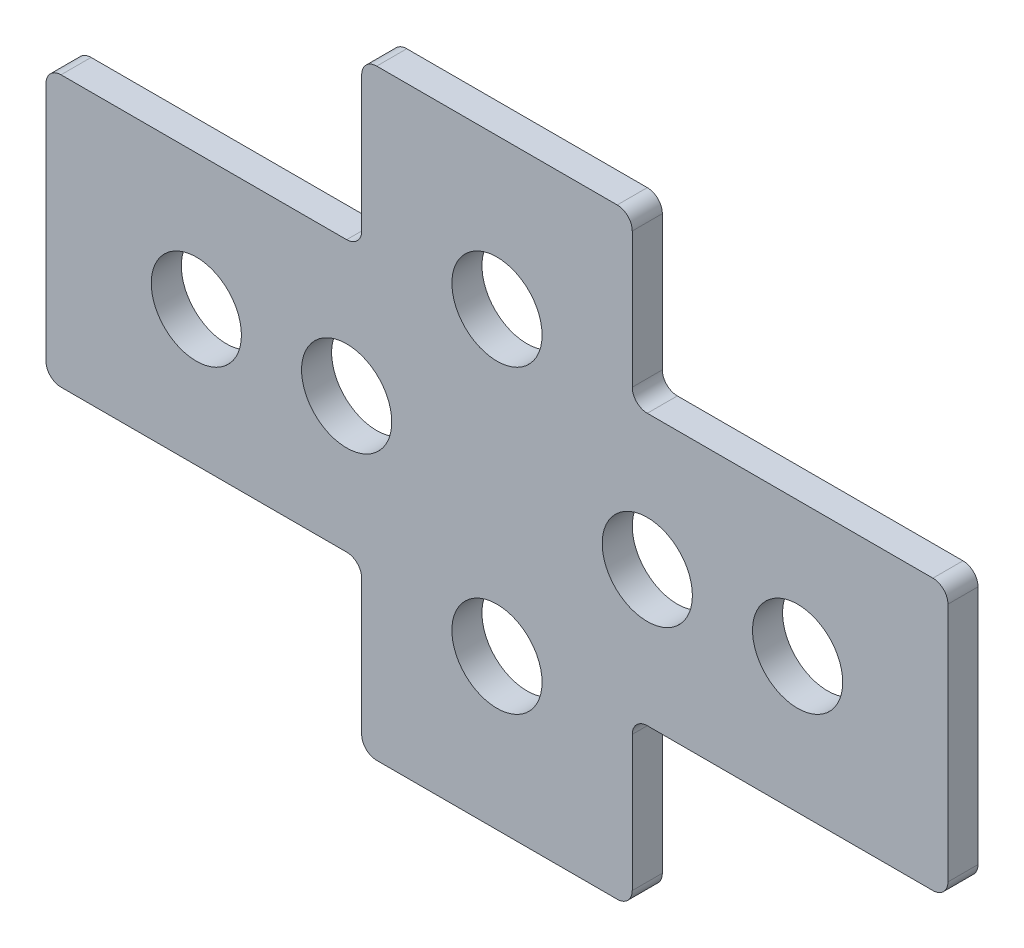
ISO-10303-21;
HEADER;
FILE_DESCRIPTION(('STEP AP214'),'2;1');
FILE_NAME('part.step','',(''),(''),'','','');
FILE_SCHEMA(('AUTOMOTIVE_DESIGN { 1 0 10303 214 1 1 1 1 }'));
ENDSEC;
DATA;
#1=APPLICATION_CONTEXT('core data for automotive mechanical design processes');
#2=APPLICATION_PROTOCOL_DEFINITION('international standard','automotive_design',2000,#1);
#3=PRODUCT_CONTEXT('',#1,'mechanical');
#4=PRODUCT('Part','Part','',(#3));
#5=PRODUCT_RELATED_PRODUCT_CATEGORY('part','',(#4));
#6=PRODUCT_DEFINITION_FORMATION('','',#4);
#7=PRODUCT_DEFINITION_CONTEXT('part definition',#1,'design');
#8=PRODUCT_DEFINITION('design','',#6,#7);
#9=PRODUCT_DEFINITION_SHAPE('','',#8);
#10=(LENGTH_UNIT() NAMED_UNIT(*) SI_UNIT(.MILLI.,.METRE.));
#11=(NAMED_UNIT(*) PLANE_ANGLE_UNIT() SI_UNIT($,.RADIAN.));
#12=(NAMED_UNIT(*) SI_UNIT($,.STERADIAN.) SOLID_ANGLE_UNIT());
#13=UNCERTAINTY_MEASURE_WITH_UNIT(LENGTH_MEASURE(1.E-05),#10,'distance_accuracy_value','');
#14=(GEOMETRIC_REPRESENTATION_CONTEXT(3) GLOBAL_UNCERTAINTY_ASSIGNED_CONTEXT((#13)) GLOBAL_UNIT_ASSIGNED_CONTEXT((#10,
#11,#12)) REPRESENTATION_CONTEXT('',''));
#15=CARTESIAN_POINT('',(0.,0.,0.));
#16=DIRECTION('',(0.,0.,1.));
#17=DIRECTION('',(1.,0.,0.));
#18=AXIS2_PLACEMENT_3D('',#15,#16,#17);
#19=CARTESIAN_POINT('',(-8.00000000000045,-9.00000000000045,2.));
#20=DIRECTION('',(0.,0.,1.));
#21=DIRECTION('',(1.,0.,0.));
#22=AXIS2_PLACEMENT_3D('',#19,#20,#21);
#23=PLANE('',#22);
#24=CARTESIAN_POINT('',(20.,10.,2.));
#25=DIRECTION('',(0.,0.,1.));
#26=DIRECTION('',(1.,0.,0.));
#27=AXIS2_PLACEMENT_3D('',#24,#25,#26);
#28=CIRCLE('',#27,3.);
#29=CARTESIAN_POINT('',(23.,10.,2.));
#30=VERTEX_POINT('',#29);
#31=EDGE_CURVE('E460',#30,#30,#28,.T.);
#32=ORIENTED_EDGE('',*,*,#31,.F.);
#33=EDGE_LOOP('',(#32));
#34=FACE_BOUND('',#33,.T.);
#35=CARTESIAN_POINT('',(-20.,10.,2.));
#36=DIRECTION('',(0.,0.,1.));
#37=DIRECTION('',(1.,0.,0.));
#38=AXIS2_PLACEMENT_3D('',#35,#36,#37);
#39=CIRCLE('',#38,3.);
#40=CARTESIAN_POINT('',(-17.,10.,2.));
#41=VERTEX_POINT('',#40);
#42=EDGE_CURVE('E472',#41,#41,#39,.T.);
#43=ORIENTED_EDGE('',*,*,#42,.F.);
#44=EDGE_LOOP('',(#43));
#45=FACE_BOUND('',#44,.T.);
#46=CARTESIAN_POINT('',(0.,20.,2.));
#47=DIRECTION('',(0.,0.,1.));
#48=DIRECTION('',(1.,0.,0.));
#49=AXIS2_PLACEMENT_3D('',#46,#47,#48);
#50=CIRCLE('',#49,3.);
#51=CARTESIAN_POINT('',(3.,20.,2.));
#52=VERTEX_POINT('',#51);
#53=EDGE_CURVE('E234',#52,#52,#50,.T.);
#54=ORIENTED_EDGE('',*,*,#53,.F.);
#55=EDGE_LOOP('',(#54));
#56=FACE_BOUND('',#55,.T.);
#57=CARTESIAN_POINT('',(-8.00000000000045,-9.00000000000045,2.));
#58=DIRECTION('',(0.,0.,1.));
#59=DIRECTION('',(1.,0.,0.));
#60=AXIS2_PLACEMENT_3D('',#57,#58,#59);
#61=CIRCLE('',#60,0.999999999999545);
#62=CARTESIAN_POINT('',(-9.,-9.,2.));
#63=VERTEX_POINT('',#62);
#64=CARTESIAN_POINT('',(-8.,-10.,2.));
#65=VERTEX_POINT('',#64);
#66=EDGE_CURVE('E277',#63,#65,#61,.T.);
#67=ORIENTED_EDGE('',*,*,#66,.T.);
#68=DIRECTION('',(1.,0.,0.));
#69=VECTOR('',#68,1.);
#70=CARTESIAN_POINT('',(-8.,-10.,2.));
#71=LINE('',#70,#69);
#72=CARTESIAN_POINT('',(8.,-10.0000000000002,2.));
#73=VERTEX_POINT('',#72);
#74=EDGE_CURVE('E145',#65,#73,#71,.T.);
#75=ORIENTED_EDGE('',*,*,#74,.T.);
#76=CARTESIAN_POINT('',(7.99999999999955,-9.,2.));
#77=DIRECTION('',(0.,0.,1.));
#78=DIRECTION('',(1.,0.,0.));
#79=AXIS2_PLACEMENT_3D('',#76,#77,#78);
#80=CIRCLE('',#79,1.00000000000023);
#81=CARTESIAN_POINT('',(9.,-9.,2.));
#82=VERTEX_POINT('',#81);
#83=EDGE_CURVE('E340',#73,#82,#80,.T.);
#84=ORIENTED_EDGE('',*,*,#83,.T.);
#85=DIRECTION('',(0.,1.,0.));
#86=VECTOR('',#85,1.);
#87=CARTESIAN_POINT('',(9.,-9.,2.));
#88=LINE('',#87,#86);
#89=CARTESIAN_POINT('',(9.,0.,2.));
#90=VERTEX_POINT('',#89);
#91=EDGE_CURVE('E359',#82,#90,#88,.T.);
#92=ORIENTED_EDGE('',*,*,#91,.T.);
#93=CARTESIAN_POINT('',(10.,0.,2.));
#94=DIRECTION('',(0.,0.,-1.));
#95=DIRECTION('',(1.,0.,0.));
#96=AXIS2_PLACEMENT_3D('',#93,#94,#95);
#97=CIRCLE('',#96,1.);
#98=CARTESIAN_POINT('',(10.,1.,2.));
#99=VERTEX_POINT('',#98);
#100=EDGE_CURVE('E356',#90,#99,#97,.T.);
#101=ORIENTED_EDGE('',*,*,#100,.T.);
#102=DIRECTION('',(1.,0.,0.));
#103=VECTOR('',#102,1.);
#104=CARTESIAN_POINT('',(10.,1.,2.));
#105=LINE('',#104,#103);
#106=CARTESIAN_POINT('',(29.,1.,2.));
#107=VERTEX_POINT('',#106);
#108=EDGE_CURVE('E358',#99,#107,#105,.T.);
#109=ORIENTED_EDGE('',*,*,#108,.T.);
#110=CARTESIAN_POINT('',(29.,2.,2.));
#111=DIRECTION('',(0.,0.,1.));
#112=DIRECTION('',(1.,0.,0.));
#113=AXIS2_PLACEMENT_3D('',#110,#111,#112);
#114=CIRCLE('',#113,0.999999999999999);
#115=CARTESIAN_POINT('',(30.,2.,2.));
#116=VERTEX_POINT('',#115);
#117=EDGE_CURVE('E361',#107,#116,#114,.T.);
#118=ORIENTED_EDGE('',*,*,#117,.T.);
#119=DIRECTION('',(0.,1.,0.));
#120=VECTOR('',#119,1.);
#121=CARTESIAN_POINT('',(30.,18.,2.));
#122=LINE('',#121,#120);
#123=CARTESIAN_POINT('',(30.,18.,2.));
#124=VERTEX_POINT('',#123);
#125=EDGE_CURVE('E367',#116,#124,#122,.T.);
#126=ORIENTED_EDGE('',*,*,#125,.T.);
#127=CARTESIAN_POINT('',(29.0000000000005,18.0000000000005,2.));
#128=DIRECTION('',(0.,0.,1.));
#129=DIRECTION('',(1.,0.,0.));
#130=AXIS2_PLACEMENT_3D('',#127,#128,#129);
#131=CIRCLE('',#130,0.999999999999543);
#132=CARTESIAN_POINT('',(29.,19.,2.));
#133=VERTEX_POINT('',#132);
#134=EDGE_CURVE('E369',#124,#133,#131,.T.);
#135=ORIENTED_EDGE('',*,*,#134,.T.);
#136=DIRECTION('',(-1.,0.,0.));
#137=VECTOR('',#136,1.);
#138=CARTESIAN_POINT('',(10.,19.,2.));
#139=LINE('',#138,#137);
#140=CARTESIAN_POINT('',(10.,19.,2.));
#141=VERTEX_POINT('',#140);
#142=EDGE_CURVE('E371',#133,#141,#139,.T.);
#143=ORIENTED_EDGE('',*,*,#142,.T.);
#144=CARTESIAN_POINT('',(10.,20.,2.));
#145=DIRECTION('',(0.,0.,-1.));
#146=DIRECTION('',(1.,0.,0.));
#147=AXIS2_PLACEMENT_3D('',#144,#145,#146);
#148=CIRCLE('',#147,1.);
#149=CARTESIAN_POINT('',(9.,20.,2.));
#150=VERTEX_POINT('',#149);
#151=EDGE_CURVE('E373',#141,#150,#148,.T.);
#152=ORIENTED_EDGE('',*,*,#151,.T.);
#153=DIRECTION('',(0.,1.,0.));
#154=VECTOR('',#153,1.);
#155=CARTESIAN_POINT('',(9.,20.,2.));
#156=LINE('',#155,#154);
#157=CARTESIAN_POINT('',(9.,29.,2.));
#158=VERTEX_POINT('',#157);
#159=EDGE_CURVE('E375',#150,#158,#156,.T.);
#160=ORIENTED_EDGE('',*,*,#159,.T.);
#161=CARTESIAN_POINT('',(8.00000000000045,29.0000000000005,2.));
#162=DIRECTION('',(0.,0.,1.));
#163=DIRECTION('',(1.,0.,0.));
#164=AXIS2_PLACEMENT_3D('',#161,#162,#163);
#165=CIRCLE('',#164,0.999999999999545);
#166=CARTESIAN_POINT('',(8.,30.,2.));
#167=VERTEX_POINT('',#166);
#168=EDGE_CURVE('E377',#158,#167,#165,.T.);
#169=ORIENTED_EDGE('',*,*,#168,.T.);
#170=DIRECTION('',(-1.,0.,0.));
#171=VECTOR('',#170,1.);
#172=CARTESIAN_POINT('',(8.,30.,2.));
#173=LINE('',#172,#171);
#174=CARTESIAN_POINT('',(-8.,30.,2.));
#175=VERTEX_POINT('',#174);
#176=EDGE_CURVE('E379',#167,#175,#173,.T.);
#177=ORIENTED_EDGE('',*,*,#176,.T.);
#178=CARTESIAN_POINT('',(-8.,29.,2.));
#179=DIRECTION('',(0.,0.,1.));
#180=DIRECTION('',(1.,0.,0.));
#181=AXIS2_PLACEMENT_3D('',#178,#179,#180);
#182=CIRCLE('',#181,0.999999999999999);
#183=CARTESIAN_POINT('',(-9.,29.,2.));
#184=VERTEX_POINT('',#183);
#185=EDGE_CURVE('E381',#175,#184,#182,.T.);
#186=ORIENTED_EDGE('',*,*,#185,.T.);
#187=DIRECTION('',(0.,-1.,0.));
#188=VECTOR('',#187,1.);
#189=CARTESIAN_POINT('',(-9.,20.,2.));
#190=LINE('',#189,#188);
#191=CARTESIAN_POINT('',(-9.,20.,2.));
#192=VERTEX_POINT('',#191);
#193=EDGE_CURVE('E383',#184,#192,#190,.T.);
#194=ORIENTED_EDGE('',*,*,#193,.T.);
#195=CARTESIAN_POINT('',(-10.,20.,2.));
#196=DIRECTION('',(0.,0.,-1.));
#197=DIRECTION('',(1.,0.,0.));
#198=AXIS2_PLACEMENT_3D('',#195,#196,#197);
#199=CIRCLE('',#198,1.);
#200=CARTESIAN_POINT('',(-10.,19.,2.));
#201=VERTEX_POINT('',#200);
#202=EDGE_CURVE('E385',#192,#201,#199,.T.);
#203=ORIENTED_EDGE('',*,*,#202,.T.);
#204=DIRECTION('',(-1.,0.,0.));
#205=VECTOR('',#204,1.);
#206=CARTESIAN_POINT('',(-29.,19.,2.));
#207=LINE('',#206,#205);
#208=CARTESIAN_POINT('',(-29.,19.,2.));
#209=VERTEX_POINT('',#208);
#210=EDGE_CURVE('E387',#201,#209,#207,.T.);
#211=ORIENTED_EDGE('',*,*,#210,.T.);
#212=CARTESIAN_POINT('',(-29.,18.,2.));
#213=DIRECTION('',(0.,0.,1.));
#214=DIRECTION('',(1.,0.,0.));
#215=AXIS2_PLACEMENT_3D('',#212,#213,#214);
#216=CIRCLE('',#215,0.999999999999997);
#217=CARTESIAN_POINT('',(-30.,18.,2.));
#218=VERTEX_POINT('',#217);
#219=EDGE_CURVE('E389',#209,#218,#216,.T.);
#220=ORIENTED_EDGE('',*,*,#219,.T.);
#221=DIRECTION('',(0.,-1.,0.));
#222=VECTOR('',#221,1.);
#223=CARTESIAN_POINT('',(-30.,2.,2.));
#224=LINE('',#223,#222);
#225=CARTESIAN_POINT('',(-30.,2.,2.));
#226=VERTEX_POINT('',#225);
#227=EDGE_CURVE('E391',#218,#226,#224,.T.);
#228=ORIENTED_EDGE('',*,*,#227,.T.);
#229=CARTESIAN_POINT('',(-29.0000000000005,1.99999999999955,2.));
#230=DIRECTION('',(0.,0.,1.));
#231=DIRECTION('',(1.,0.,0.));
#232=AXIS2_PLACEMENT_3D('',#229,#230,#231);
#233=CIRCLE('',#232,0.999999999999544);
#234=CARTESIAN_POINT('',(-29.,1.,2.));
#235=VERTEX_POINT('',#234);
#236=EDGE_CURVE('E212',#226,#235,#233,.T.);
#237=ORIENTED_EDGE('',*,*,#236,.T.);
#238=DIRECTION('',(1.,0.,0.));
#239=VECTOR('',#238,1.);
#240=CARTESIAN_POINT('',(-29.,1.,2.));
#241=LINE('',#240,#239);
#242=CARTESIAN_POINT('',(-9.99999999999955,1.,2.));
#243=VERTEX_POINT('',#242);
#244=EDGE_CURVE('E206',#235,#243,#241,.T.);
#245=ORIENTED_EDGE('',*,*,#244,.T.);
#246=CARTESIAN_POINT('',(-9.99999999999955,0.,2.));
#247=DIRECTION('',(0.,0.,-1.));
#248=DIRECTION('',(1.,0.,0.));
#249=AXIS2_PLACEMENT_3D('',#246,#247,#248);
#250=CIRCLE('',#249,1.);
#251=CARTESIAN_POINT('',(-8.99999999999955,0.,2.));
#252=VERTEX_POINT('',#251);
#253=EDGE_CURVE('E210',#243,#252,#250,.T.);
#254=ORIENTED_EDGE('',*,*,#253,.T.);
#255=DIRECTION('',(0.,-1.,0.));
#256=VECTOR('',#255,1.);
#257=CARTESIAN_POINT('',(-9.,-9.,2.));
#258=LINE('',#257,#256);
#259=EDGE_CURVE('E54',#252,#63,#258,.T.);
#260=ORIENTED_EDGE('',*,*,#259,.T.);
#261=EDGE_LOOP('',(#67,#75,#84,#92,#101,#109,#118,#126,#135,#143,#152,#160,#169,#177,#186,#194,
#203,#211,#220,#228,#237,#245,#254,#260));
#262=FACE_BOUND('',#261,.T.);
#263=CARTESIAN_POINT('',(0.,0.,2.));
#264=DIRECTION('',(0.,0.,1.));
#265=DIRECTION('',(1.,0.,0.));
#266=AXIS2_PLACEMENT_3D('',#263,#264,#265);
#267=CIRCLE('',#266,3.);
#268=CARTESIAN_POINT('',(3.,0.,2.));
#269=VERTEX_POINT('',#268);
#270=EDGE_CURVE('E478',#269,#269,#267,.T.);
#271=ORIENTED_EDGE('',*,*,#270,.F.);
#272=EDGE_LOOP('',(#271));
#273=FACE_BOUND('',#272,.T.);
#274=CARTESIAN_POINT('',(-10.,10.,2.));
#275=DIRECTION('',(0.,0.,1.));
#276=DIRECTION('',(1.,0.,0.));
#277=AXIS2_PLACEMENT_3D('',#274,#275,#276);
#278=CIRCLE('',#277,3.);
#279=CARTESIAN_POINT('',(-7.,10.,2.));
#280=VERTEX_POINT('',#279);
#281=EDGE_CURVE('E466',#280,#280,#278,.T.);
#282=ORIENTED_EDGE('',*,*,#281,.F.);
#283=EDGE_LOOP('',(#282));
#284=FACE_BOUND('',#283,.T.);
#285=CARTESIAN_POINT('',(10.,10.,2.));
#286=DIRECTION('',(0.,0.,1.));
#287=DIRECTION('',(1.,0.,0.));
#288=AXIS2_PLACEMENT_3D('',#285,#286,#287);
#289=CIRCLE('',#288,3.);
#290=CARTESIAN_POINT('',(13.,10.,2.));
#291=VERTEX_POINT('',#290);
#292=EDGE_CURVE('E451',#291,#291,#289,.T.);
#293=ORIENTED_EDGE('',*,*,#292,.F.);
#294=EDGE_LOOP('',(#293));
#295=FACE_BOUND('',#294,.T.);
#296=ADVANCED_FACE('F37',(#34,#45,#56,#262,#273,#284,#295),#23,.T.);
#297=CARTESIAN_POINT('',(-8.00000000000045,-9.00000000000045,0.));
#298=DIRECTION('',(0.,0.,1.));
#299=DIRECTION('',(1.,0.,0.));
#300=AXIS2_PLACEMENT_3D('',#297,#298,#299);
#301=PLANE('',#300);
#302=CARTESIAN_POINT('',(20.,10.,0.));
#303=DIRECTION('',(0.,0.,1.));
#304=DIRECTION('',(1.,0.,0.));
#305=AXIS2_PLACEMENT_3D('',#302,#303,#304);
#306=CIRCLE('',#305,3.);
#307=CARTESIAN_POINT('',(23.,10.,0.));
#308=VERTEX_POINT('',#307);
#309=EDGE_CURVE('E457',#308,#308,#306,.T.);
#310=ORIENTED_EDGE('',*,*,#309,.T.);
#311=EDGE_LOOP('',(#310));
#312=FACE_BOUND('',#311,.T.);
#313=CARTESIAN_POINT('',(-20.,10.,0.));
#314=DIRECTION('',(0.,0.,1.));
#315=DIRECTION('',(1.,0.,0.));
#316=AXIS2_PLACEMENT_3D('',#313,#314,#315);
#317=CIRCLE('',#316,3.);
#318=CARTESIAN_POINT('',(-17.,10.,0.));
#319=VERTEX_POINT('',#318);
#320=EDGE_CURVE('E469',#319,#319,#317,.T.);
#321=ORIENTED_EDGE('',*,*,#320,.T.);
#322=EDGE_LOOP('',(#321));
#323=FACE_BOUND('',#322,.T.);
#324=CARTESIAN_POINT('',(0.,20.,0.));
#325=DIRECTION('',(0.,0.,1.));
#326=DIRECTION('',(1.,0.,0.));
#327=AXIS2_PLACEMENT_3D('',#324,#325,#326);
#328=CIRCLE('',#327,3.);
#329=CARTESIAN_POINT('',(3.,20.,0.));
#330=VERTEX_POINT('',#329);
#331=EDGE_CURVE('E481',#330,#330,#328,.T.);
#332=ORIENTED_EDGE('',*,*,#331,.T.);
#333=EDGE_LOOP('',(#332));
#334=FACE_BOUND('',#333,.T.);
#335=CARTESIAN_POINT('',(-8.00000000000045,-9.00000000000045,0.));
#336=DIRECTION('',(0.,0.,1.));
#337=DIRECTION('',(1.,0.,0.));
#338=AXIS2_PLACEMENT_3D('',#335,#336,#337);
#339=CIRCLE('',#338,0.999999999999545);
#340=CARTESIAN_POINT('',(-9.,-9.,0.));
#341=VERTEX_POINT('',#340);
#342=CARTESIAN_POINT('',(-8.,-10.,0.));
#343=VERTEX_POINT('',#342);
#344=EDGE_CURVE('E230',#341,#343,#339,.T.);
#345=ORIENTED_EDGE('',*,*,#344,.F.);
#346=DIRECTION('',(0.,-1.,0.));
#347=VECTOR('',#346,1.);
#348=CARTESIAN_POINT('',(-9.,-9.,0.));
#349=LINE('',#348,#347);
#350=CARTESIAN_POINT('',(-8.99999999999955,0.,0.));
#351=VERTEX_POINT('',#350);
#352=EDGE_CURVE('E137',#351,#341,#349,.T.);
#353=ORIENTED_EDGE('',*,*,#352,.F.);
#354=CARTESIAN_POINT('',(-9.99999999999955,0.,0.));
#355=DIRECTION('',(0.,0.,-1.));
#356=DIRECTION('',(1.,0.,0.));
#357=AXIS2_PLACEMENT_3D('',#354,#355,#356);
#358=CIRCLE('',#357,1.);
#359=CARTESIAN_POINT('',(-9.99999999999955,1.,0.));
#360=VERTEX_POINT('',#359);
#361=EDGE_CURVE('E131',#360,#351,#358,.T.);
#362=ORIENTED_EDGE('',*,*,#361,.F.);
#363=DIRECTION('',(1.,0.,0.));
#364=VECTOR('',#363,1.);
#365=CARTESIAN_POINT('',(-29.,1.,0.));
#366=LINE('',#365,#364);
#367=CARTESIAN_POINT('',(-29.,1.,0.));
#368=VERTEX_POINT('',#367);
#369=EDGE_CURVE('E220',#368,#360,#366,.T.);
#370=ORIENTED_EDGE('',*,*,#369,.F.);
#371=CARTESIAN_POINT('',(-29.0000000000005,1.99999999999955,0.));
#372=DIRECTION('',(0.,0.,1.));
#373=DIRECTION('',(1.,0.,0.));
#374=AXIS2_PLACEMENT_3D('',#371,#372,#373);
#375=CIRCLE('',#374,0.999999999999544);
#376=CARTESIAN_POINT('',(-30.,2.,0.));
#377=VERTEX_POINT('',#376);
#378=EDGE_CURVE('E272',#377,#368,#375,.T.);
#379=ORIENTED_EDGE('',*,*,#378,.F.);
#380=DIRECTION('',(0.,-1.,0.));
#381=VECTOR('',#380,1.);
#382=CARTESIAN_POINT('',(-30.,2.,0.));
#383=LINE('',#382,#381);
#384=CARTESIAN_POINT('',(-30.,18.,0.));
#385=VERTEX_POINT('',#384);
#386=EDGE_CURVE('E270',#385,#377,#383,.T.);
#387=ORIENTED_EDGE('',*,*,#386,.F.);
#388=CARTESIAN_POINT('',(-29.,18.,0.));
#389=DIRECTION('',(0.,0.,1.));
#390=DIRECTION('',(1.,0.,0.));
#391=AXIS2_PLACEMENT_3D('',#388,#389,#390);
#392=CIRCLE('',#391,0.999999999999997);
#393=CARTESIAN_POINT('',(-29.,19.,0.));
#394=VERTEX_POINT('',#393);
#395=EDGE_CURVE('E268',#394,#385,#392,.T.);
#396=ORIENTED_EDGE('',*,*,#395,.F.);
#397=DIRECTION('',(-1.,0.,0.));
#398=VECTOR('',#397,1.);
#399=CARTESIAN_POINT('',(-29.,19.,0.));
#400=LINE('',#399,#398);
#401=CARTESIAN_POINT('',(-10.,19.,0.));
#402=VERTEX_POINT('',#401);
#403=EDGE_CURVE('E266',#402,#394,#400,.T.);
#404=ORIENTED_EDGE('',*,*,#403,.F.);
#405=CARTESIAN_POINT('',(-10.,20.,0.));
#406=DIRECTION('',(0.,0.,-1.));
#407=DIRECTION('',(1.,0.,0.));
#408=AXIS2_PLACEMENT_3D('',#405,#406,#407);
#409=CIRCLE('',#408,1.);
#410=CARTESIAN_POINT('',(-9.,20.,0.));
#411=VERTEX_POINT('',#410);
#412=EDGE_CURVE('E264',#411,#402,#409,.T.);
#413=ORIENTED_EDGE('',*,*,#412,.F.);
#414=DIRECTION('',(0.,-1.,0.));
#415=VECTOR('',#414,1.);
#416=CARTESIAN_POINT('',(-9.,20.,0.));
#417=LINE('',#416,#415);
#418=CARTESIAN_POINT('',(-9.,29.,0.));
#419=VERTEX_POINT('',#418);
#420=EDGE_CURVE('E262',#419,#411,#417,.T.);
#421=ORIENTED_EDGE('',*,*,#420,.F.);
#422=CARTESIAN_POINT('',(-8.,29.,0.));
#423=DIRECTION('',(0.,0.,1.));
#424=DIRECTION('',(1.,0.,0.));
#425=AXIS2_PLACEMENT_3D('',#422,#423,#424);
#426=CIRCLE('',#425,0.999999999999999);
#427=CARTESIAN_POINT('',(-8.,30.,0.));
#428=VERTEX_POINT('',#427);
#429=EDGE_CURVE('E260',#428,#419,#426,.T.);
#430=ORIENTED_EDGE('',*,*,#429,.F.);
#431=DIRECTION('',(-1.,0.,0.));
#432=VECTOR('',#431,1.);
#433=CARTESIAN_POINT('',(8.,30.,0.));
#434=LINE('',#433,#432);
#435=CARTESIAN_POINT('',(8.,30.,0.));
#436=VERTEX_POINT('',#435);
#437=EDGE_CURVE('E258',#436,#428,#434,.T.);
#438=ORIENTED_EDGE('',*,*,#437,.F.);
#439=CARTESIAN_POINT('',(8.00000000000045,29.0000000000005,0.));
#440=DIRECTION('',(0.,0.,1.));
#441=DIRECTION('',(1.,0.,0.));
#442=AXIS2_PLACEMENT_3D('',#439,#440,#441);
#443=CIRCLE('',#442,0.999999999999545);
#444=CARTESIAN_POINT('',(9.,29.,0.));
#445=VERTEX_POINT('',#444);
#446=EDGE_CURVE('E256',#445,#436,#443,.T.);
#447=ORIENTED_EDGE('',*,*,#446,.F.);
#448=DIRECTION('',(0.,1.,0.));
#449=VECTOR('',#448,1.);
#450=CARTESIAN_POINT('',(9.,20.,0.));
#451=LINE('',#450,#449);
#452=CARTESIAN_POINT('',(9.,20.,0.));
#453=VERTEX_POINT('',#452);
#454=EDGE_CURVE('E254',#453,#445,#451,.T.);
#455=ORIENTED_EDGE('',*,*,#454,.F.);
#456=CARTESIAN_POINT('',(10.,20.,0.));
#457=DIRECTION('',(0.,0.,-1.));
#458=DIRECTION('',(1.,0.,0.));
#459=AXIS2_PLACEMENT_3D('',#456,#457,#458);
#460=CIRCLE('',#459,1.);
#461=CARTESIAN_POINT('',(10.,19.,0.));
#462=VERTEX_POINT('',#461);
#463=EDGE_CURVE('E252',#462,#453,#460,.T.);
#464=ORIENTED_EDGE('',*,*,#463,.F.);
#465=DIRECTION('',(-1.,0.,0.));
#466=VECTOR('',#465,1.);
#467=CARTESIAN_POINT('',(10.,19.,0.));
#468=LINE('',#467,#466);
#469=CARTESIAN_POINT('',(29.,19.,0.));
#470=VERTEX_POINT('',#469);
#471=EDGE_CURVE('E250',#470,#462,#468,.T.);
#472=ORIENTED_EDGE('',*,*,#471,.F.);
#473=CARTESIAN_POINT('',(29.0000000000005,18.0000000000005,0.));
#474=DIRECTION('',(0.,0.,1.));
#475=DIRECTION('',(1.,0.,0.));
#476=AXIS2_PLACEMENT_3D('',#473,#474,#475);
#477=CIRCLE('',#476,0.999999999999543);
#478=CARTESIAN_POINT('',(30.,18.,0.));
#479=VERTEX_POINT('',#478);
#480=EDGE_CURVE('E248',#479,#470,#477,.T.);
#481=ORIENTED_EDGE('',*,*,#480,.F.);
#482=DIRECTION('',(0.,1.,0.));
#483=VECTOR('',#482,1.);
#484=CARTESIAN_POINT('',(30.,18.,0.));
#485=LINE('',#484,#483);
#486=CARTESIAN_POINT('',(30.,2.,0.));
#487=VERTEX_POINT('',#486);
#488=EDGE_CURVE('E246',#487,#479,#485,.T.);
#489=ORIENTED_EDGE('',*,*,#488,.F.);
#490=CARTESIAN_POINT('',(29.,2.,0.));
#491=DIRECTION('',(0.,0.,1.));
#492=DIRECTION('',(1.,0.,0.));
#493=AXIS2_PLACEMENT_3D('',#490,#491,#492);
#494=CIRCLE('',#493,0.999999999999999);
#495=CARTESIAN_POINT('',(29.,1.,0.));
#496=VERTEX_POINT('',#495);
#497=EDGE_CURVE('E244',#496,#487,#494,.T.);
#498=ORIENTED_EDGE('',*,*,#497,.F.);
#499=DIRECTION('',(1.,0.,0.));
#500=VECTOR('',#499,1.);
#501=CARTESIAN_POINT('',(10.,1.,0.));
#502=LINE('',#501,#500);
#503=CARTESIAN_POINT('',(10.,1.,0.));
#504=VERTEX_POINT('',#503);
#505=EDGE_CURVE('E242',#504,#496,#502,.T.);
#506=ORIENTED_EDGE('',*,*,#505,.F.);
#507=CARTESIAN_POINT('',(10.,0.,0.));
#508=DIRECTION('',(0.,0.,-1.));
#509=DIRECTION('',(1.,0.,0.));
#510=AXIS2_PLACEMENT_3D('',#507,#508,#509);
#511=CIRCLE('',#510,1.);
#512=CARTESIAN_POINT('',(9.,0.,0.));
#513=VERTEX_POINT('',#512);
#514=EDGE_CURVE('E240',#513,#504,#511,.T.);
#515=ORIENTED_EDGE('',*,*,#514,.F.);
#516=DIRECTION('',(0.,1.,0.));
#517=VECTOR('',#516,1.);
#518=CARTESIAN_POINT('',(9.,-9.,0.));
#519=LINE('',#518,#517);
#520=CARTESIAN_POINT('',(9.,-9.,0.));
#521=VERTEX_POINT('',#520);
#522=EDGE_CURVE('E238',#521,#513,#519,.T.);
#523=ORIENTED_EDGE('',*,*,#522,.F.);
#524=CARTESIAN_POINT('',(7.99999999999955,-9.,0.));
#525=DIRECTION('',(0.,0.,1.));
#526=DIRECTION('',(1.,0.,0.));
#527=AXIS2_PLACEMENT_3D('',#524,#525,#526);
#528=CIRCLE('',#527,1.00000000000023);
#529=CARTESIAN_POINT('',(8.,-10.0000000000002,0.));
#530=VERTEX_POINT('',#529);
#531=EDGE_CURVE('E236',#530,#521,#528,.T.);
#532=ORIENTED_EDGE('',*,*,#531,.F.);
#533=DIRECTION('',(1.,0.,0.));
#534=VECTOR('',#533,1.);
#535=CARTESIAN_POINT('',(-8.,-10.,0.));
#536=LINE('',#535,#534);
#537=EDGE_CURVE('E233',#343,#530,#536,.T.);
#538=ORIENTED_EDGE('',*,*,#537,.F.);
#539=EDGE_LOOP('',(#345,#353,#362,#370,#379,#387,#396,#404,#413,#421,#430,#438,#447,#455,#464,
#472,#481,#489,#498,#506,#515,#523,#532,#538));
#540=FACE_BOUND('',#539,.T.);
#541=CARTESIAN_POINT('',(0.,0.,0.));
#542=DIRECTION('',(0.,0.,1.));
#543=DIRECTION('',(1.,0.,0.));
#544=AXIS2_PLACEMENT_3D('',#541,#542,#543);
#545=CIRCLE('',#544,3.);
#546=CARTESIAN_POINT('',(3.,0.,0.));
#547=VERTEX_POINT('',#546);
#548=EDGE_CURVE('E475',#547,#547,#545,.T.);
#549=ORIENTED_EDGE('',*,*,#548,.T.);
#550=EDGE_LOOP('',(#549));
#551=FACE_BOUND('',#550,.T.);
#552=CARTESIAN_POINT('',(-10.,10.,0.));
#553=DIRECTION('',(0.,0.,1.));
#554=DIRECTION('',(1.,0.,0.));
#555=AXIS2_PLACEMENT_3D('',#552,#553,#554);
#556=CIRCLE('',#555,3.);
#557=CARTESIAN_POINT('',(-7.,10.,0.));
#558=VERTEX_POINT('',#557);
#559=EDGE_CURVE('E463',#558,#558,#556,.T.);
#560=ORIENTED_EDGE('',*,*,#559,.T.);
#561=EDGE_LOOP('',(#560));
#562=FACE_BOUND('',#561,.T.);
#563=CARTESIAN_POINT('',(10.,10.,0.));
#564=DIRECTION('',(0.,0.,1.));
#565=DIRECTION('',(1.,0.,0.));
#566=AXIS2_PLACEMENT_3D('',#563,#564,#565);
#567=CIRCLE('',#566,3.);
#568=CARTESIAN_POINT('',(13.,10.,0.));
#569=VERTEX_POINT('',#568);
#570=EDGE_CURVE('E454',#569,#569,#567,.T.);
#571=ORIENTED_EDGE('',*,*,#570,.T.);
#572=EDGE_LOOP('',(#571));
#573=FACE_BOUND('',#572,.T.);
#574=ADVANCED_FACE('F344',(#312,#323,#334,#540,#551,#562,#573),#301,.F.);
#575=CARTESIAN_POINT('',(-8.00000000000045,-9.00000000000045,2.));
#576=DIRECTION('',(0.,0.,-1.));
#577=DIRECTION('',(-1.,0.,0.));
#578=AXIS2_PLACEMENT_3D('',#575,#576,#577);
#579=CYLINDRICAL_SURFACE('',#578,0.999999999999545);
#580=ORIENTED_EDGE('',*,*,#344,.T.);
#581=DIRECTION('',(0.,0.,-1.));
#582=VECTOR('',#581,1.);
#583=CARTESIAN_POINT('',(-8.,-10.,2.));
#584=LINE('',#583,#582);
#585=EDGE_CURVE('E11',#65,#343,#584,.T.);
#586=ORIENTED_EDGE('',*,*,#585,.F.);
#587=ORIENTED_EDGE('',*,*,#66,.F.);
#588=DIRECTION('',(0.,0.,-1.));
#589=VECTOR('',#588,1.);
#590=CARTESIAN_POINT('',(-9.,-9.,2.));
#591=LINE('',#590,#589);
#592=EDGE_CURVE('E226',#63,#341,#591,.T.);
#593=ORIENTED_EDGE('',*,*,#592,.T.);
#594=EDGE_LOOP('',(#580,#586,#587,#593));
#595=FACE_BOUND('',#594,.T.);
#596=ADVANCED_FACE('F39',(#595),#579,.T.);
#597=CARTESIAN_POINT('',(-8.,-10.,2.));
#598=DIRECTION('',(0.,1.,0.));
#599=DIRECTION('',(0.,0.,1.));
#600=AXIS2_PLACEMENT_3D('',#597,#598,#599);
#601=PLANE('',#600);
#602=ORIENTED_EDGE('',*,*,#537,.T.);
#603=DIRECTION('',(0.,0.,-1.));
#604=VECTOR('',#603,1.);
#605=CARTESIAN_POINT('',(8.,-10.0000000000002,2.));
#606=LINE('',#605,#604);
#607=EDGE_CURVE('E46',#73,#530,#606,.T.);
#608=ORIENTED_EDGE('',*,*,#607,.F.);
#609=ORIENTED_EDGE('',*,*,#74,.F.);
#610=ORIENTED_EDGE('',*,*,#585,.T.);
#611=EDGE_LOOP('',(#602,#608,#609,#610));
#612=FACE_BOUND('',#611,.T.);
#613=ADVANCED_FACE('F728',(#612),#601,.F.);
#614=CARTESIAN_POINT('',(7.99999999999955,-9.,2.));
#615=DIRECTION('',(0.,0.,-1.));
#616=DIRECTION('',(-1.,0.,0.));
#617=AXIS2_PLACEMENT_3D('',#614,#615,#616);
#618=CYLINDRICAL_SURFACE('',#617,1.00000000000023);
#619=ORIENTED_EDGE('',*,*,#531,.T.);
#620=DIRECTION('',(0.,0.,-1.));
#621=VECTOR('',#620,1.);
#622=CARTESIAN_POINT('',(9.,-9.,2.));
#623=LINE('',#622,#621);
#624=EDGE_CURVE('E332',#82,#521,#623,.T.);
#625=ORIENTED_EDGE('',*,*,#624,.F.);
#626=ORIENTED_EDGE('',*,*,#83,.F.);
#627=ORIENTED_EDGE('',*,*,#607,.T.);
#628=EDGE_LOOP('',(#619,#625,#626,#627));
#629=FACE_BOUND('',#628,.T.);
#630=ADVANCED_FACE('F338',(#629),#618,.T.);
#631=CARTESIAN_POINT('',(9.,-9.,2.));
#632=DIRECTION('',(-1.,0.,0.));
#633=DIRECTION('',(0.,0.,1.));
#634=AXIS2_PLACEMENT_3D('',#631,#632,#633);
#635=PLANE('',#634);
#636=ORIENTED_EDGE('',*,*,#522,.T.);
#637=DIRECTION('',(0.,0.,-1.));
#638=VECTOR('',#637,1.);
#639=CARTESIAN_POINT('',(9.,0.,2.));
#640=LINE('',#639,#638);
#641=EDGE_CURVE('E329',#90,#513,#640,.T.);
#642=ORIENTED_EDGE('',*,*,#641,.F.);
#643=ORIENTED_EDGE('',*,*,#91,.F.);
#644=ORIENTED_EDGE('',*,*,#624,.T.);
#645=EDGE_LOOP('',(#636,#642,#643,#644));
#646=FACE_BOUND('',#645,.T.);
#647=ADVANCED_FACE('F350',(#646),#635,.F.);
#648=CARTESIAN_POINT('',(10.,0.,2.));
#649=DIRECTION('',(0.,0.,-1.));
#650=DIRECTION('',(-1.,0.,0.));
#651=AXIS2_PLACEMENT_3D('',#648,#649,#650);
#652=CYLINDRICAL_SURFACE('',#651,1.);
#653=ORIENTED_EDGE('',*,*,#514,.T.);
#654=DIRECTION('',(0.,0.,-1.));
#655=VECTOR('',#654,1.);
#656=CARTESIAN_POINT('',(10.,1.,2.));
#657=LINE('',#656,#655);
#658=EDGE_CURVE('E326',#99,#504,#657,.T.);
#659=ORIENTED_EDGE('',*,*,#658,.F.);
#660=ORIENTED_EDGE('',*,*,#100,.F.);
#661=ORIENTED_EDGE('',*,*,#641,.T.);
#662=EDGE_LOOP('',(#653,#659,#660,#661));
#663=FACE_BOUND('',#662,.T.);
#664=ADVANCED_FACE('F354',(#663),#652,.F.);
#665=CARTESIAN_POINT('',(10.,1.,2.));
#666=DIRECTION('',(0.,1.,0.));
#667=DIRECTION('',(0.,0.,1.));
#668=AXIS2_PLACEMENT_3D('',#665,#666,#667);
#669=PLANE('',#668);
#670=ORIENTED_EDGE('',*,*,#505,.T.);
#671=DIRECTION('',(0.,0.,-1.));
#672=VECTOR('',#671,1.);
#673=CARTESIAN_POINT('',(29.,1.,2.));
#674=LINE('',#673,#672);
#675=EDGE_CURVE('E323',#107,#496,#674,.T.);
#676=ORIENTED_EDGE('',*,*,#675,.F.);
#677=ORIENTED_EDGE('',*,*,#108,.F.);
#678=ORIENTED_EDGE('',*,*,#658,.T.);
#679=EDGE_LOOP('',(#670,#676,#677,#678));
#680=FACE_BOUND('',#679,.T.);
#681=ADVANCED_FACE('F693',(#680),#669,.F.);
#682=CARTESIAN_POINT('',(29.,2.,2.));
#683=DIRECTION('',(0.,0.,-1.));
#684=DIRECTION('',(-1.,0.,0.));
#685=AXIS2_PLACEMENT_3D('',#682,#683,#684);
#686=CYLINDRICAL_SURFACE('',#685,0.999999999999999);
#687=ORIENTED_EDGE('',*,*,#497,.T.);
#688=DIRECTION('',(0.,0.,-1.));
#689=VECTOR('',#688,1.);
#690=CARTESIAN_POINT('',(30.,2.,2.));
#691=LINE('',#690,#689);
#692=EDGE_CURVE('E320',#116,#487,#691,.T.);
#693=ORIENTED_EDGE('',*,*,#692,.F.);
#694=ORIENTED_EDGE('',*,*,#117,.F.);
#695=ORIENTED_EDGE('',*,*,#675,.T.);
#696=EDGE_LOOP('',(#687,#693,#694,#695));
#697=FACE_BOUND('',#696,.T.);
#698=ADVANCED_FACE('F683',(#697),#686,.T.);
#699=CARTESIAN_POINT('',(30.,18.,2.));
#700=DIRECTION('',(-1.,0.,0.));
#701=DIRECTION('',(0.,0.,1.));
#702=AXIS2_PLACEMENT_3D('',#699,#700,#701);
#703=PLANE('',#702);
#704=ORIENTED_EDGE('',*,*,#488,.T.);
#705=DIRECTION('',(0.,0.,-1.));
#706=VECTOR('',#705,1.);
#707=CARTESIAN_POINT('',(30.,18.,2.));
#708=LINE('',#707,#706);
#709=EDGE_CURVE('E317',#124,#479,#708,.T.);
#710=ORIENTED_EDGE('',*,*,#709,.F.);
#711=ORIENTED_EDGE('',*,*,#125,.F.);
#712=ORIENTED_EDGE('',*,*,#692,.T.);
#713=EDGE_LOOP('',(#704,#710,#711,#712));
#714=FACE_BOUND('',#713,.T.);
#715=ADVANCED_FACE('F673',(#714),#703,.F.);
#716=CARTESIAN_POINT('',(29.0000000000005,18.0000000000005,2.));
#717=DIRECTION('',(0.,0.,-1.));
#718=DIRECTION('',(-1.,0.,0.));
#719=AXIS2_PLACEMENT_3D('',#716,#717,#718);
#720=CYLINDRICAL_SURFACE('',#719,0.999999999999543);
#721=ORIENTED_EDGE('',*,*,#480,.T.);
#722=DIRECTION('',(0.,0.,-1.));
#723=VECTOR('',#722,1.);
#724=CARTESIAN_POINT('',(29.,19.,2.));
#725=LINE('',#724,#723);
#726=EDGE_CURVE('E314',#133,#470,#725,.T.);
#727=ORIENTED_EDGE('',*,*,#726,.F.);
#728=ORIENTED_EDGE('',*,*,#134,.F.);
#729=ORIENTED_EDGE('',*,*,#709,.T.);
#730=EDGE_LOOP('',(#721,#727,#728,#729));
#731=FACE_BOUND('',#730,.T.);
#732=ADVANCED_FACE('F663',(#731),#720,.T.);
#733=CARTESIAN_POINT('',(10.,19.,2.));
#734=DIRECTION('',(0.,-1.,0.));
#735=DIRECTION('',(0.,0.,-1.));
#736=AXIS2_PLACEMENT_3D('',#733,#734,#735);
#737=PLANE('',#736);
#738=ORIENTED_EDGE('',*,*,#471,.T.);
#739=DIRECTION('',(0.,0.,-1.));
#740=VECTOR('',#739,1.);
#741=CARTESIAN_POINT('',(10.,19.,2.));
#742=LINE('',#741,#740);
#743=EDGE_CURVE('E311',#141,#462,#742,.T.);
#744=ORIENTED_EDGE('',*,*,#743,.F.);
#745=ORIENTED_EDGE('',*,*,#142,.F.);
#746=ORIENTED_EDGE('',*,*,#726,.T.);
#747=EDGE_LOOP('',(#738,#744,#745,#746));
#748=FACE_BOUND('',#747,.T.);
#749=ADVANCED_FACE('F653',(#748),#737,.F.);
#750=CARTESIAN_POINT('',(10.,20.,2.));
#751=DIRECTION('',(0.,0.,-1.));
#752=DIRECTION('',(-1.,0.,0.));
#753=AXIS2_PLACEMENT_3D('',#750,#751,#752);
#754=CYLINDRICAL_SURFACE('',#753,1.);
#755=ORIENTED_EDGE('',*,*,#463,.T.);
#756=DIRECTION('',(0.,0.,-1.));
#757=VECTOR('',#756,1.);
#758=CARTESIAN_POINT('',(9.,20.,2.));
#759=LINE('',#758,#757);
#760=EDGE_CURVE('E308',#150,#453,#759,.T.);
#761=ORIENTED_EDGE('',*,*,#760,.F.);
#762=ORIENTED_EDGE('',*,*,#151,.F.);
#763=ORIENTED_EDGE('',*,*,#743,.T.);
#764=EDGE_LOOP('',(#755,#761,#762,#763));
#765=FACE_BOUND('',#764,.T.);
#766=ADVANCED_FACE('F643',(#765),#754,.F.);
#767=CARTESIAN_POINT('',(9.,20.,2.));
#768=DIRECTION('',(-1.,0.,0.));
#769=DIRECTION('',(0.,0.,1.));
#770=AXIS2_PLACEMENT_3D('',#767,#768,#769);
#771=PLANE('',#770);
#772=ORIENTED_EDGE('',*,*,#454,.T.);
#773=DIRECTION('',(0.,0.,-1.));
#774=VECTOR('',#773,1.);
#775=CARTESIAN_POINT('',(9.,29.,2.));
#776=LINE('',#775,#774);
#777=EDGE_CURVE('E305',#158,#445,#776,.T.);
#778=ORIENTED_EDGE('',*,*,#777,.F.);
#779=ORIENTED_EDGE('',*,*,#159,.F.);
#780=ORIENTED_EDGE('',*,*,#760,.T.);
#781=EDGE_LOOP('',(#772,#778,#779,#780));
#782=FACE_BOUND('',#781,.T.);
#783=ADVANCED_FACE('F633',(#782),#771,.F.);
#784=CARTESIAN_POINT('',(8.00000000000045,29.0000000000005,2.));
#785=DIRECTION('',(0.,0.,-1.));
#786=DIRECTION('',(-1.,0.,0.));
#787=AXIS2_PLACEMENT_3D('',#784,#785,#786);
#788=CYLINDRICAL_SURFACE('',#787,0.999999999999545);
#789=ORIENTED_EDGE('',*,*,#446,.T.);
#790=DIRECTION('',(0.,0.,-1.));
#791=VECTOR('',#790,1.);
#792=CARTESIAN_POINT('',(8.,30.,2.));
#793=LINE('',#792,#791);
#794=EDGE_CURVE('E302',#167,#436,#793,.T.);
#795=ORIENTED_EDGE('',*,*,#794,.F.);
#796=ORIENTED_EDGE('',*,*,#168,.F.);
#797=ORIENTED_EDGE('',*,*,#777,.T.);
#798=EDGE_LOOP('',(#789,#795,#796,#797));
#799=FACE_BOUND('',#798,.T.);
#800=ADVANCED_FACE('F623',(#799),#788,.T.);
#801=CARTESIAN_POINT('',(8.,30.,2.));
#802=DIRECTION('',(0.,-1.,0.));
#803=DIRECTION('',(0.,0.,-1.));
#804=AXIS2_PLACEMENT_3D('',#801,#802,#803);
#805=PLANE('',#804);
#806=ORIENTED_EDGE('',*,*,#437,.T.);
#807=DIRECTION('',(0.,0.,-1.));
#808=VECTOR('',#807,1.);
#809=CARTESIAN_POINT('',(-8.,30.,2.));
#810=LINE('',#809,#808);
#811=EDGE_CURVE('E299',#175,#428,#810,.T.);
#812=ORIENTED_EDGE('',*,*,#811,.F.);
#813=ORIENTED_EDGE('',*,*,#176,.F.);
#814=ORIENTED_EDGE('',*,*,#794,.T.);
#815=EDGE_LOOP('',(#806,#812,#813,#814));
#816=FACE_BOUND('',#815,.T.);
#817=ADVANCED_FACE('F613',(#816),#805,.F.);
#818=CARTESIAN_POINT('',(-8.,29.,2.));
#819=DIRECTION('',(0.,0.,-1.));
#820=DIRECTION('',(-1.,0.,0.));
#821=AXIS2_PLACEMENT_3D('',#818,#819,#820);
#822=CYLINDRICAL_SURFACE('',#821,0.999999999999999);
#823=ORIENTED_EDGE('',*,*,#429,.T.);
#824=DIRECTION('',(0.,0.,-1.));
#825=VECTOR('',#824,1.);
#826=CARTESIAN_POINT('',(-9.,29.,2.));
#827=LINE('',#826,#825);
#828=EDGE_CURVE('E296',#184,#419,#827,.T.);
#829=ORIENTED_EDGE('',*,*,#828,.F.);
#830=ORIENTED_EDGE('',*,*,#185,.F.);
#831=ORIENTED_EDGE('',*,*,#811,.T.);
#832=EDGE_LOOP('',(#823,#829,#830,#831));
#833=FACE_BOUND('',#832,.T.);
#834=ADVANCED_FACE('F603',(#833),#822,.T.);
#835=CARTESIAN_POINT('',(-9.,20.,2.));
#836=DIRECTION('',(1.,0.,0.));
#837=DIRECTION('',(0.,0.,-1.));
#838=AXIS2_PLACEMENT_3D('',#835,#836,#837);
#839=PLANE('',#838);
#840=ORIENTED_EDGE('',*,*,#420,.T.);
#841=DIRECTION('',(0.,0.,-1.));
#842=VECTOR('',#841,1.);
#843=CARTESIAN_POINT('',(-9.,20.,2.));
#844=LINE('',#843,#842);
#845=EDGE_CURVE('E293',#192,#411,#844,.T.);
#846=ORIENTED_EDGE('',*,*,#845,.F.);
#847=ORIENTED_EDGE('',*,*,#193,.F.);
#848=ORIENTED_EDGE('',*,*,#828,.T.);
#849=EDGE_LOOP('',(#840,#846,#847,#848));
#850=FACE_BOUND('',#849,.T.);
#851=ADVANCED_FACE('F593',(#850),#839,.F.);
#852=CARTESIAN_POINT('',(-10.,20.,2.));
#853=DIRECTION('',(0.,0.,-1.));
#854=DIRECTION('',(-1.,0.,0.));
#855=AXIS2_PLACEMENT_3D('',#852,#853,#854);
#856=CYLINDRICAL_SURFACE('',#855,1.);
#857=ORIENTED_EDGE('',*,*,#412,.T.);
#858=DIRECTION('',(0.,0.,-1.));
#859=VECTOR('',#858,1.);
#860=CARTESIAN_POINT('',(-10.,19.,2.));
#861=LINE('',#860,#859);
#862=EDGE_CURVE('E290',#201,#402,#861,.T.);
#863=ORIENTED_EDGE('',*,*,#862,.F.);
#864=ORIENTED_EDGE('',*,*,#202,.F.);
#865=ORIENTED_EDGE('',*,*,#845,.T.);
#866=EDGE_LOOP('',(#857,#863,#864,#865));
#867=FACE_BOUND('',#866,.T.);
#868=ADVANCED_FACE('F583',(#867),#856,.F.);
#869=CARTESIAN_POINT('',(-29.,19.,2.));
#870=DIRECTION('',(0.,-1.,0.));
#871=DIRECTION('',(0.,0.,-1.));
#872=AXIS2_PLACEMENT_3D('',#869,#870,#871);
#873=PLANE('',#872);
#874=ORIENTED_EDGE('',*,*,#403,.T.);
#875=DIRECTION('',(0.,0.,-1.));
#876=VECTOR('',#875,1.);
#877=CARTESIAN_POINT('',(-29.,19.,2.));
#878=LINE('',#877,#876);
#879=EDGE_CURVE('E287',#209,#394,#878,.T.);
#880=ORIENTED_EDGE('',*,*,#879,.F.);
#881=ORIENTED_EDGE('',*,*,#210,.F.);
#882=ORIENTED_EDGE('',*,*,#862,.T.);
#883=EDGE_LOOP('',(#874,#880,#881,#882));
#884=FACE_BOUND('',#883,.T.);
#885=ADVANCED_FACE('F573',(#884),#873,.F.);
#886=CARTESIAN_POINT('',(-29.,18.,2.));
#887=DIRECTION('',(0.,0.,-1.));
#888=DIRECTION('',(-1.,0.,0.));
#889=AXIS2_PLACEMENT_3D('',#886,#887,#888);
#890=CYLINDRICAL_SURFACE('',#889,0.999999999999997);
#891=ORIENTED_EDGE('',*,*,#395,.T.);
#892=DIRECTION('',(0.,0.,-1.));
#893=VECTOR('',#892,1.);
#894=CARTESIAN_POINT('',(-30.,18.,2.));
#895=LINE('',#894,#893);
#896=EDGE_CURVE('E284',#218,#385,#895,.T.);
#897=ORIENTED_EDGE('',*,*,#896,.F.);
#898=ORIENTED_EDGE('',*,*,#219,.F.);
#899=ORIENTED_EDGE('',*,*,#879,.T.);
#900=EDGE_LOOP('',(#891,#897,#898,#899));
#901=FACE_BOUND('',#900,.T.);
#902=ADVANCED_FACE('F564',(#901),#890,.T.);
#903=CARTESIAN_POINT('',(-30.,2.,2.));
#904=DIRECTION('',(1.,0.,0.));
#905=DIRECTION('',(0.,0.,-1.));
#906=AXIS2_PLACEMENT_3D('',#903,#904,#905);
#907=PLANE('',#906);
#908=ORIENTED_EDGE('',*,*,#386,.T.);
#909=DIRECTION('',(0.,0.,-1.));
#910=VECTOR('',#909,1.);
#911=CARTESIAN_POINT('',(-30.,2.,2.));
#912=LINE('',#911,#910);
#913=EDGE_CURVE('E281',#226,#377,#912,.T.);
#914=ORIENTED_EDGE('',*,*,#913,.F.);
#915=ORIENTED_EDGE('',*,*,#227,.F.);
#916=ORIENTED_EDGE('',*,*,#896,.T.);
#917=EDGE_LOOP('',(#908,#914,#915,#916));
#918=FACE_BOUND('',#917,.T.);
#919=ADVANCED_FACE('F397',(#918),#907,.F.);
#920=CARTESIAN_POINT('',(-29.0000000000005,1.99999999999955,2.));
#921=DIRECTION('',(0.,0.,-1.));
#922=DIRECTION('',(-1.,0.,0.));
#923=AXIS2_PLACEMENT_3D('',#920,#921,#922);
#924=CYLINDRICAL_SURFACE('',#923,0.999999999999544);
#925=ORIENTED_EDGE('',*,*,#378,.T.);
#926=DIRECTION('',(0.,0.,-1.));
#927=VECTOR('',#926,1.);
#928=CARTESIAN_POINT('',(-29.,1.,2.));
#929=LINE('',#928,#927);
#930=EDGE_CURVE('E221',#235,#368,#929,.T.);
#931=ORIENTED_EDGE('',*,*,#930,.F.);
#932=ORIENTED_EDGE('',*,*,#236,.F.);
#933=ORIENTED_EDGE('',*,*,#913,.T.);
#934=EDGE_LOOP('',(#925,#931,#932,#933));
#935=FACE_BOUND('',#934,.T.);
#936=ADVANCED_FACE('F401',(#935),#924,.T.);
#937=CARTESIAN_POINT('',(-29.,1.,2.));
#938=DIRECTION('',(0.,1.,0.));
#939=DIRECTION('',(0.,0.,1.));
#940=AXIS2_PLACEMENT_3D('',#937,#938,#939);
#941=PLANE('',#940);
#942=ORIENTED_EDGE('',*,*,#369,.T.);
#943=DIRECTION('',(0.,0.,-1.));
#944=VECTOR('',#943,1.);
#945=CARTESIAN_POINT('',(-9.99999999999955,1.,2.));
#946=LINE('',#945,#944);
#947=EDGE_CURVE('E217',#243,#360,#946,.T.);
#948=ORIENTED_EDGE('',*,*,#947,.F.);
#949=ORIENTED_EDGE('',*,*,#244,.F.);
#950=ORIENTED_EDGE('',*,*,#930,.T.);
#951=EDGE_LOOP('',(#942,#948,#949,#950));
#952=FACE_BOUND('',#951,.T.);
#953=ADVANCED_FACE('F218',(#952),#941,.F.);
#954=CARTESIAN_POINT('',(-9.99999999999955,0.,2.));
#955=DIRECTION('',(0.,0.,-1.));
#956=DIRECTION('',(-1.,0.,0.));
#957=AXIS2_PLACEMENT_3D('',#954,#955,#956);
#958=CYLINDRICAL_SURFACE('',#957,1.);
#959=ORIENTED_EDGE('',*,*,#361,.T.);
#960=DIRECTION('',(0.,0.,-1.));
#961=VECTOR('',#960,1.);
#962=CARTESIAN_POINT('',(-8.99999999999955,0.,2.));
#963=LINE('',#962,#961);
#964=EDGE_CURVE('E222',#252,#351,#963,.T.);
#965=ORIENTED_EDGE('',*,*,#964,.F.);
#966=ORIENTED_EDGE('',*,*,#253,.F.);
#967=ORIENTED_EDGE('',*,*,#947,.T.);
#968=EDGE_LOOP('',(#959,#965,#966,#967));
#969=FACE_BOUND('',#968,.T.);
#970=ADVANCED_FACE('F224',(#969),#958,.F.);
#971=CARTESIAN_POINT('',(-9.,-9.,2.));
#972=DIRECTION('',(1.,0.,0.));
#973=DIRECTION('',(0.,1.,0.));
#974=AXIS2_PLACEMENT_3D('',#971,#972,#973);
#975=PLANE('',#974);
#976=ORIENTED_EDGE('',*,*,#352,.T.);
#977=ORIENTED_EDGE('',*,*,#592,.F.);
#978=ORIENTED_EDGE('',*,*,#259,.F.);
#979=ORIENTED_EDGE('',*,*,#964,.T.);
#980=EDGE_LOOP('',(#976,#977,#978,#979));
#981=FACE_BOUND('',#980,.T.);
#982=ADVANCED_FACE('F405',(#981),#975,.F.);
#983=CARTESIAN_POINT('',(0.,20.,2.));
#984=DIRECTION('',(0.,0.,-1.));
#985=DIRECTION('',(-1.,0.,0.));
#986=AXIS2_PLACEMENT_3D('',#983,#984,#985);
#987=CYLINDRICAL_SURFACE('',#986,3.);
#988=ORIENTED_EDGE('',*,*,#53,.T.);
#989=EDGE_LOOP('',(#988));
#990=FACE_BOUND('',#989,.T.);
#991=ORIENTED_EDGE('',*,*,#331,.F.);
#992=EDGE_LOOP('',(#991));
#993=FACE_BOUND('',#992,.T.);
#994=ADVANCED_FACE('F407',(#990,#993),#987,.F.);
#995=CARTESIAN_POINT('',(0.,0.,2.));
#996=DIRECTION('',(0.,0.,-1.));
#997=DIRECTION('',(-1.,0.,0.));
#998=AXIS2_PLACEMENT_3D('',#995,#996,#997);
#999=CYLINDRICAL_SURFACE('',#998,3.);
#1000=ORIENTED_EDGE('',*,*,#270,.T.);
#1001=EDGE_LOOP('',(#1000));
#1002=FACE_BOUND('',#1001,.T.);
#1003=ORIENTED_EDGE('',*,*,#548,.F.);
#1004=EDGE_LOOP('',(#1003));
#1005=FACE_BOUND('',#1004,.T.);
#1006=ADVANCED_FACE('F413',(#1002,#1005),#999,.F.);
#1007=CARTESIAN_POINT('',(-20.,10.,2.));
#1008=DIRECTION('',(0.,0.,-1.));
#1009=DIRECTION('',(-1.,0.,0.));
#1010=AXIS2_PLACEMENT_3D('',#1007,#1008,#1009);
#1011=CYLINDRICAL_SURFACE('',#1010,3.);
#1012=ORIENTED_EDGE('',*,*,#42,.T.);
#1013=EDGE_LOOP('',(#1012));
#1014=FACE_BOUND('',#1013,.T.);
#1015=ORIENTED_EDGE('',*,*,#320,.F.);
#1016=EDGE_LOOP('',(#1015));
#1017=FACE_BOUND('',#1016,.T.);
#1018=ADVANCED_FACE('F430',(#1014,#1017),#1011,.F.);
#1019=CARTESIAN_POINT('',(-10.,10.,2.));
#1020=DIRECTION('',(0.,0.,-1.));
#1021=DIRECTION('',(-1.,0.,0.));
#1022=AXIS2_PLACEMENT_3D('',#1019,#1020,#1021);
#1023=CYLINDRICAL_SURFACE('',#1022,3.);
#1024=ORIENTED_EDGE('',*,*,#281,.T.);
#1025=EDGE_LOOP('',(#1024));
#1026=FACE_BOUND('',#1025,.T.);
#1027=ORIENTED_EDGE('',*,*,#559,.F.);
#1028=EDGE_LOOP('',(#1027));
#1029=FACE_BOUND('',#1028,.T.);
#1030=ADVANCED_FACE('F434',(#1026,#1029),#1023,.F.);
#1031=CARTESIAN_POINT('',(20.,10.,2.));
#1032=DIRECTION('',(0.,0.,-1.));
#1033=DIRECTION('',(-1.,0.,0.));
#1034=AXIS2_PLACEMENT_3D('',#1031,#1032,#1033);
#1035=CYLINDRICAL_SURFACE('',#1034,3.);
#1036=ORIENTED_EDGE('',*,*,#31,.T.);
#1037=EDGE_LOOP('',(#1036));
#1038=FACE_BOUND('',#1037,.T.);
#1039=ORIENTED_EDGE('',*,*,#309,.F.);
#1040=EDGE_LOOP('',(#1039));
#1041=FACE_BOUND('',#1040,.T.);
#1042=ADVANCED_FACE('F438',(#1038,#1041),#1035,.F.);
#1043=CARTESIAN_POINT('',(10.,10.,2.));
#1044=DIRECTION('',(0.,0.,-1.));
#1045=DIRECTION('',(-1.,0.,0.));
#1046=AXIS2_PLACEMENT_3D('',#1043,#1044,#1045);
#1047=CYLINDRICAL_SURFACE('',#1046,3.);
#1048=ORIENTED_EDGE('',*,*,#292,.T.);
#1049=EDGE_LOOP('',(#1048));
#1050=FACE_BOUND('',#1049,.T.);
#1051=ORIENTED_EDGE('',*,*,#570,.F.);
#1052=EDGE_LOOP('',(#1051));
#1053=FACE_BOUND('',#1052,.T.);
#1054=ADVANCED_FACE('F442',(#1050,#1053),#1047,.F.);
#1055=CLOSED_SHELL('',(#296,#574,#596,#613,#630,#647,#664,#681,#698,#715,#732,#749,#766,#783,
#800,#817,#834,#851,#868,#885,#902,#919,#936,#953,#970,#982,#994,#1006,#1018,#1030,#1042,#1054));
#1056=MANIFOLD_SOLID_BREP('B2',#1055);
#1057=ADVANCED_BREP_SHAPE_REPRESENTATION('',(#18,#1056),#14);
#1058=SHAPE_DEFINITION_REPRESENTATION(#9,#1057);
ENDSEC;
END-ISO-10303-21;
